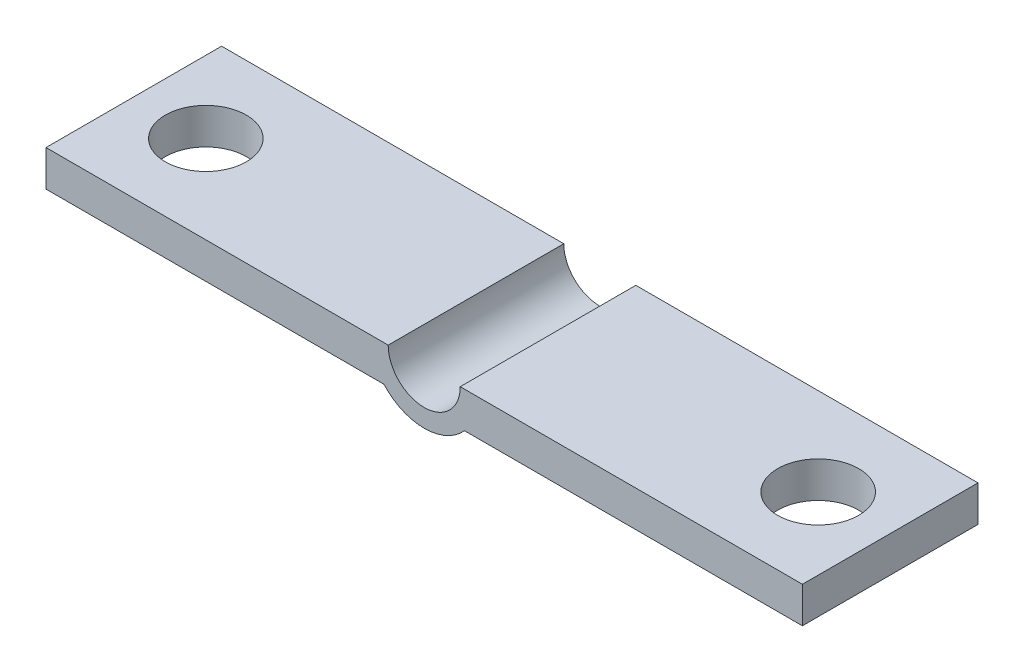
ISO-10303-21;
HEADER;
FILE_DESCRIPTION(('STEP AP214'),'2;1');
FILE_NAME('part.step','',(''),(''),'','','');
FILE_SCHEMA(('AUTOMOTIVE_DESIGN { 1 0 10303 214 1 1 1 1 }'));
ENDSEC;
DATA;
#1=APPLICATION_CONTEXT('core data for automotive mechanical design processes');
#2=APPLICATION_PROTOCOL_DEFINITION('international standard','automotive_design',2000,#1);
#3=PRODUCT_CONTEXT('',#1,'mechanical');
#4=PRODUCT('Part','Part','',(#3));
#5=PRODUCT_RELATED_PRODUCT_CATEGORY('part','',(#4));
#6=PRODUCT_DEFINITION_FORMATION('','',#4);
#7=PRODUCT_DEFINITION_CONTEXT('part definition',#1,'design');
#8=PRODUCT_DEFINITION('design','',#6,#7);
#9=PRODUCT_DEFINITION_SHAPE('','',#8);
#10=(LENGTH_UNIT() NAMED_UNIT(*) SI_UNIT(.MILLI.,.METRE.));
#11=(NAMED_UNIT(*) PLANE_ANGLE_UNIT() SI_UNIT($,.RADIAN.));
#12=(NAMED_UNIT(*) SI_UNIT($,.STERADIAN.) SOLID_ANGLE_UNIT());
#13=UNCERTAINTY_MEASURE_WITH_UNIT(LENGTH_MEASURE(1.E-05),#10,'distance_accuracy_value','');
#14=(GEOMETRIC_REPRESENTATION_CONTEXT(3) GLOBAL_UNCERTAINTY_ASSIGNED_CONTEXT((#13)) GLOBAL_UNIT_ASSIGNED_CONTEXT((#10,
#11,#12)) REPRESENTATION_CONTEXT('',''));
#15=CARTESIAN_POINT('',(0.,0.,0.));
#16=DIRECTION('',(0.,0.,1.));
#17=DIRECTION('',(1.,0.,0.));
#18=AXIS2_PLACEMENT_3D('',#15,#16,#17);
#19=CARTESIAN_POINT('',(0.,0.,9.75));
#20=DIRECTION('',(0.,0.,-1.));
#21=DIRECTION('',(-1.,0.,0.));
#22=AXIS2_PLACEMENT_3D('',#19,#20,#21);
#23=CYLINDRICAL_SURFACE('',#22,3.);
#24=CARTESIAN_POINT('',(0.,0.,0.));
#25=DIRECTION('',(0.,0.,1.));
#26=DIRECTION('',(1.,0.,0.));
#27=AXIS2_PLACEMENT_3D('',#24,#25,#26);
#28=CIRCLE('',#27,3.);
#29=CARTESIAN_POINT('',(-2.23606797749979,-2.,0.));
#30=VERTEX_POINT('',#29);
#31=CARTESIAN_POINT('',(2.23606797749979,-2.,0.));
#32=VERTEX_POINT('',#31);
#33=EDGE_CURVE('E123',#30,#32,#28,.T.);
#34=ORIENTED_EDGE('',*,*,#33,.T.);
#35=DIRECTION('',(0.,0.,-1.));
#36=VECTOR('',#35,1.);
#37=CARTESIAN_POINT('',(2.23606797749979,-2.,9.75));
#38=LINE('',#37,#36);
#39=CARTESIAN_POINT('',(2.23606797749979,-2.,9.75));
#40=VERTEX_POINT('',#39);
#41=EDGE_CURVE('E141',#32,#40,#38,.F.);
#42=ORIENTED_EDGE('',*,*,#41,.T.);
#43=CARTESIAN_POINT('',(0.,0.,9.75));
#44=DIRECTION('',(0.,0.,1.));
#45=DIRECTION('',(1.,0.,0.));
#46=AXIS2_PLACEMENT_3D('',#43,#44,#45);
#47=CIRCLE('',#46,3.);
#48=CARTESIAN_POINT('',(-2.23606797749979,-2.,9.75));
#49=VERTEX_POINT('',#48);
#50=EDGE_CURVE('E62',#49,#40,#47,.T.);
#51=ORIENTED_EDGE('',*,*,#50,.F.);
#52=DIRECTION('',(0.,0.,-1.));
#53=VECTOR('',#52,1.);
#54=CARTESIAN_POINT('',(-2.23606797749979,-2.,9.75));
#55=LINE('',#54,#53);
#56=EDGE_CURVE('E66',#30,#49,#55,.F.);
#57=ORIENTED_EDGE('',*,*,#56,.F.);
#58=EDGE_LOOP('',(#34,#42,#51,#57));
#59=FACE_BOUND('',#58,.T.);
#60=ADVANCED_FACE('F45',(#59),#23,.T.);
#61=CARTESIAN_POINT('',(2.,0.,9.75));
#62=DIRECTION('',(0.,1.,0.));
#63=DIRECTION('',(0.,0.,1.));
#64=AXIS2_PLACEMENT_3D('',#61,#62,#63);
#65=PLANE('',#64);
#66=CARTESIAN_POINT('',(17.,0.,4.875));
#67=DIRECTION('',(0.,1.,0.));
#68=DIRECTION('',(1.,0.,0.));
#69=AXIS2_PLACEMENT_3D('',#66,#67,#68);
#70=CIRCLE('',#69,2.25);
#71=CARTESIAN_POINT('',(19.25,0.,4.875));
#72=VERTEX_POINT('',#71);
#73=EDGE_CURVE('E210',#72,#72,#70,.T.);
#74=ORIENTED_EDGE('',*,*,#73,.F.);
#75=EDGE_LOOP('',(#74));
#76=FACE_BOUND('',#75,.T.);
#77=DIRECTION('',(1.,0.,0.));
#78=VECTOR('',#77,1.);
#79=CARTESIAN_POINT('',(2.,0.,0.));
#80=LINE('',#79,#78);
#81=CARTESIAN_POINT('',(2.,0.,0.));
#82=VERTEX_POINT('',#81);
#83=CARTESIAN_POINT('',(21.,0.,0.));
#84=VERTEX_POINT('',#83);
#85=EDGE_CURVE('E111',#82,#84,#80,.T.);
#86=ORIENTED_EDGE('',*,*,#85,.F.);
#87=DIRECTION('',(0.,0.,-1.));
#88=VECTOR('',#87,1.);
#89=CARTESIAN_POINT('',(2.,0.,9.75));
#90=LINE('',#89,#88);
#91=CARTESIAN_POINT('',(2.,0.,9.75));
#92=VERTEX_POINT('',#91);
#93=EDGE_CURVE('E11',#92,#82,#90,.T.);
#94=ORIENTED_EDGE('',*,*,#93,.F.);
#95=DIRECTION('',(1.,0.,0.));
#96=VECTOR('',#95,1.);
#97=CARTESIAN_POINT('',(2.,0.,9.75));
#98=LINE('',#97,#96);
#99=CARTESIAN_POINT('',(21.,0.,9.75));
#100=VERTEX_POINT('',#99);
#101=EDGE_CURVE('E138',#92,#100,#98,.T.);
#102=ORIENTED_EDGE('',*,*,#101,.T.);
#103=DIRECTION('',(0.,0.,-1.));
#104=VECTOR('',#103,1.);
#105=CARTESIAN_POINT('',(21.,0.,0.));
#106=LINE('',#105,#104);
#107=EDGE_CURVE('E130',#100,#84,#106,.T.);
#108=ORIENTED_EDGE('',*,*,#107,.T.);
#109=EDGE_LOOP('',(#86,#94,#102,#108));
#110=FACE_BOUND('',#109,.T.);
#111=ADVANCED_FACE('F136',(#76,#110),#65,.T.);
#112=CARTESIAN_POINT('',(0.,0.,9.75));
#113=DIRECTION('',(0.,0.,-1.));
#114=DIRECTION('',(-1.,0.,0.));
#115=AXIS2_PLACEMENT_3D('',#112,#113,#114);
#116=CYLINDRICAL_SURFACE('',#115,2.);
#117=CARTESIAN_POINT('',(0.,0.,0.));
#118=DIRECTION('',(0.,0.,1.));
#119=DIRECTION('',(1.,0.,0.));
#120=AXIS2_PLACEMENT_3D('',#117,#118,#119);
#121=CIRCLE('',#120,2.);
#122=CARTESIAN_POINT('',(-2.,0.,0.));
#123=VERTEX_POINT('',#122);
#124=EDGE_CURVE('E119',#123,#82,#121,.T.);
#125=ORIENTED_EDGE('',*,*,#124,.F.);
#126=DIRECTION('',(0.,0.,-1.));
#127=VECTOR('',#126,1.);
#128=CARTESIAN_POINT('',(-2.,0.,9.75));
#129=LINE('',#128,#127);
#130=CARTESIAN_POINT('',(-2.,0.,9.75));
#131=VERTEX_POINT('',#130);
#132=EDGE_CURVE('E54',#131,#123,#129,.T.);
#133=ORIENTED_EDGE('',*,*,#132,.F.);
#134=CARTESIAN_POINT('',(0.,0.,9.75));
#135=DIRECTION('',(0.,0.,1.));
#136=DIRECTION('',(1.,0.,0.));
#137=AXIS2_PLACEMENT_3D('',#134,#135,#136);
#138=CIRCLE('',#137,2.);
#139=EDGE_CURVE('E185',#131,#92,#138,.T.);
#140=ORIENTED_EDGE('',*,*,#139,.T.);
#141=ORIENTED_EDGE('',*,*,#93,.T.);
#142=EDGE_LOOP('',(#125,#133,#140,#141));
#143=FACE_BOUND('',#142,.T.);
#144=ADVANCED_FACE('F235',(#143),#116,.F.);
#145=CARTESIAN_POINT('',(-3.,0.,9.75));
#146=DIRECTION('',(0.,1.,0.));
#147=DIRECTION('',(-1.,0.,0.));
#148=AXIS2_PLACEMENT_3D('',#145,#146,#147);
#149=PLANE('',#148);
#150=CARTESIAN_POINT('',(-17.,0.,4.875));
#151=DIRECTION('',(0.,1.,0.));
#152=DIRECTION('',(-1.,0.,0.));
#153=AXIS2_PLACEMENT_3D('',#150,#151,#152);
#154=CIRCLE('',#153,2.25);
#155=CARTESIAN_POINT('',(-19.25,0.,4.875));
#156=VERTEX_POINT('',#155);
#157=EDGE_CURVE('E203',#156,#156,#154,.T.);
#158=ORIENTED_EDGE('',*,*,#157,.F.);
#159=EDGE_LOOP('',(#158));
#160=FACE_BOUND('',#159,.T.);
#161=DIRECTION('',(1.,0.,0.));
#162=VECTOR('',#161,1.);
#163=CARTESIAN_POINT('',(-3.,0.,0.));
#164=LINE('',#163,#162);
#165=CARTESIAN_POINT('',(-21.,0.,0.));
#166=VERTEX_POINT('',#165);
#167=EDGE_CURVE('E182',#166,#123,#164,.T.);
#168=ORIENTED_EDGE('',*,*,#167,.F.);
#169=DIRECTION('',(0.,0.,1.));
#170=VECTOR('',#169,1.);
#171=CARTESIAN_POINT('',(-21.,0.,0.));
#172=LINE('',#171,#170);
#173=CARTESIAN_POINT('',(-21.,0.,9.75));
#174=VERTEX_POINT('',#173);
#175=EDGE_CURVE('E146',#166,#174,#172,.T.);
#176=ORIENTED_EDGE('',*,*,#175,.T.);
#177=DIRECTION('',(1.,0.,0.));
#178=VECTOR('',#177,1.);
#179=CARTESIAN_POINT('',(-3.,0.,9.75));
#180=LINE('',#179,#178);
#181=EDGE_CURVE('E189',#174,#131,#180,.T.);
#182=ORIENTED_EDGE('',*,*,#181,.T.);
#183=ORIENTED_EDGE('',*,*,#132,.T.);
#184=EDGE_LOOP('',(#168,#176,#182,#183));
#185=FACE_BOUND('',#184,.T.);
#186=ADVANCED_FACE('F233',(#160,#185),#149,.T.);
#187=CARTESIAN_POINT('',(0.,0.,9.75));
#188=DIRECTION('',(0.,0.,1.));
#189=DIRECTION('',(1.,0.,0.));
#190=AXIS2_PLACEMENT_3D('',#187,#188,#189);
#191=PLANE('',#190);
#192=ORIENTED_EDGE('',*,*,#101,.F.);
#193=ORIENTED_EDGE('',*,*,#139,.F.);
#194=ORIENTED_EDGE('',*,*,#181,.F.);
#195=DIRECTION('',(0.,1.,0.));
#196=VECTOR('',#195,1.);
#197=CARTESIAN_POINT('',(-21.,-2.,9.75));
#198=LINE('',#197,#196);
#199=CARTESIAN_POINT('',(-21.,-2.,9.75));
#200=VERTEX_POINT('',#199);
#201=EDGE_CURVE('E167',#200,#174,#198,.T.);
#202=ORIENTED_EDGE('',*,*,#201,.F.);
#203=DIRECTION('',(1.,0.,0.));
#204=VECTOR('',#203,1.);
#205=CARTESIAN_POINT('',(-21.,-2.,9.75));
#206=LINE('',#205,#204);
#207=EDGE_CURVE('E160',#200,#49,#206,.T.);
#208=ORIENTED_EDGE('',*,*,#207,.T.);
#209=ORIENTED_EDGE('',*,*,#50,.T.);
#210=DIRECTION('',(1.,0.,0.));
#211=VECTOR('',#210,1.);
#212=CARTESIAN_POINT('',(2.,-2.,9.75));
#213=LINE('',#212,#211);
#214=CARTESIAN_POINT('',(21.,-2.,9.75));
#215=VERTEX_POINT('',#214);
#216=EDGE_CURVE('E142',#40,#215,#213,.T.);
#217=ORIENTED_EDGE('',*,*,#216,.T.);
#218=DIRECTION('',(0.,1.,0.));
#219=VECTOR('',#218,1.);
#220=CARTESIAN_POINT('',(21.,-2.,9.75));
#221=LINE('',#220,#219);
#222=EDGE_CURVE('E134',#215,#100,#221,.T.);
#223=ORIENTED_EDGE('',*,*,#222,.T.);
#224=EDGE_LOOP('',(#192,#193,#194,#202,#208,#209,#217,#223));
#225=FACE_BOUND('',#224,.T.);
#226=ADVANCED_FACE('F219',(#225),#191,.T.);
#227=CARTESIAN_POINT('',(0.,0.,0.));
#228=DIRECTION('',(0.,0.,1.));
#229=DIRECTION('',(1.,0.,0.));
#230=AXIS2_PLACEMENT_3D('',#227,#228,#229);
#231=PLANE('',#230);
#232=ORIENTED_EDGE('',*,*,#124,.T.);
#233=ORIENTED_EDGE('',*,*,#85,.T.);
#234=DIRECTION('',(0.,1.,0.));
#235=VECTOR('',#234,1.);
#236=CARTESIAN_POINT('',(21.,-2.,0.));
#237=LINE('',#236,#235);
#238=CARTESIAN_POINT('',(21.,-2.,0.));
#239=VERTEX_POINT('',#238);
#240=EDGE_CURVE('E115',#239,#84,#237,.T.);
#241=ORIENTED_EDGE('',*,*,#240,.F.);
#242=DIRECTION('',(-1.,0.,0.));
#243=VECTOR('',#242,1.);
#244=CARTESIAN_POINT('',(2.,-2.,0.));
#245=LINE('',#244,#243);
#246=EDGE_CURVE('E151',#239,#32,#245,.T.);
#247=ORIENTED_EDGE('',*,*,#246,.T.);
#248=ORIENTED_EDGE('',*,*,#33,.F.);
#249=DIRECTION('',(-1.,0.,0.));
#250=VECTOR('',#249,1.);
#251=CARTESIAN_POINT('',(-21.,-2.,0.));
#252=LINE('',#251,#250);
#253=CARTESIAN_POINT('',(-21.,-2.,0.));
#254=VERTEX_POINT('',#253);
#255=EDGE_CURVE('E164',#30,#254,#252,.T.);
#256=ORIENTED_EDGE('',*,*,#255,.T.);
#257=DIRECTION('',(0.,1.,0.));
#258=VECTOR('',#257,1.);
#259=CARTESIAN_POINT('',(-21.,-2.,0.));
#260=LINE('',#259,#258);
#261=EDGE_CURVE('E171',#254,#166,#260,.T.);
#262=ORIENTED_EDGE('',*,*,#261,.T.);
#263=ORIENTED_EDGE('',*,*,#167,.T.);
#264=EDGE_LOOP('',(#232,#233,#241,#247,#248,#256,#262,#263));
#265=FACE_BOUND('',#264,.T.);
#266=ADVANCED_FACE('F113',(#265),#231,.F.);
#267=CARTESIAN_POINT('',(0.,-2.,0.));
#268=DIRECTION('',(0.,1.,0.));
#269=DIRECTION('',(-1.,0.,0.));
#270=AXIS2_PLACEMENT_3D('',#267,#268,#269);
#271=PLANE('',#270);
#272=CARTESIAN_POINT('',(-17.,-2.,4.875));
#273=DIRECTION('',(0.,1.,0.));
#274=DIRECTION('',(-1.,0.,0.));
#275=AXIS2_PLACEMENT_3D('',#272,#273,#274);
#276=CIRCLE('',#275,2.25);
#277=CARTESIAN_POINT('',(-19.25,-2.,4.875));
#278=VERTEX_POINT('',#277);
#279=EDGE_CURVE('E48',#278,#278,#276,.T.);
#280=ORIENTED_EDGE('',*,*,#279,.T.);
#281=EDGE_LOOP('',(#280));
#282=FACE_BOUND('',#281,.T.);
#283=ORIENTED_EDGE('',*,*,#255,.F.);
#284=ORIENTED_EDGE('',*,*,#56,.T.);
#285=ORIENTED_EDGE('',*,*,#207,.F.);
#286=DIRECTION('',(0.,0.,1.));
#287=VECTOR('',#286,1.);
#288=CARTESIAN_POINT('',(-21.,-2.,0.));
#289=LINE('',#288,#287);
#290=EDGE_CURVE('E156',#254,#200,#289,.T.);
#291=ORIENTED_EDGE('',*,*,#290,.F.);
#292=EDGE_LOOP('',(#283,#284,#285,#291));
#293=FACE_BOUND('',#292,.T.);
#294=ADVANCED_FACE('F227',(#282,#293),#271,.F.);
#295=CARTESIAN_POINT('',(-21.,-2.,0.));
#296=DIRECTION('',(-1.,0.,0.));
#297=DIRECTION('',(0.,-1.,0.));
#298=AXIS2_PLACEMENT_3D('',#295,#296,#297);
#299=PLANE('',#298);
#300=ORIENTED_EDGE('',*,*,#175,.F.);
#301=ORIENTED_EDGE('',*,*,#261,.F.);
#302=ORIENTED_EDGE('',*,*,#290,.T.);
#303=ORIENTED_EDGE('',*,*,#201,.T.);
#304=EDGE_LOOP('',(#300,#301,#302,#303));
#305=FACE_BOUND('',#304,.T.);
#306=ADVANCED_FACE('F231',(#305),#299,.T.);
#307=CARTESIAN_POINT('',(0.,-2.,0.));
#308=DIRECTION('',(0.,-1.,0.));
#309=DIRECTION('',(1.,0.,0.));
#310=AXIS2_PLACEMENT_3D('',#307,#308,#309);
#311=PLANE('',#310);
#312=CARTESIAN_POINT('',(17.,-2.,4.875));
#313=DIRECTION('',(0.,-1.,0.));
#314=DIRECTION('',(1.,0.,0.));
#315=AXIS2_PLACEMENT_3D('',#312,#313,#314);
#316=CIRCLE('',#315,2.25);
#317=CARTESIAN_POINT('',(19.25,-2.,4.875));
#318=VERTEX_POINT('',#317);
#319=EDGE_CURVE('E200',#318,#318,#316,.T.);
#320=ORIENTED_EDGE('',*,*,#319,.F.);
#321=EDGE_LOOP('',(#320));
#322=FACE_BOUND('',#321,.T.);
#323=ORIENTED_EDGE('',*,*,#41,.F.);
#324=ORIENTED_EDGE('',*,*,#246,.F.);
#325=DIRECTION('',(0.,0.,-1.));
#326=VECTOR('',#325,1.);
#327=CARTESIAN_POINT('',(21.,-2.,0.));
#328=LINE('',#327,#326);
#329=EDGE_CURVE('E132',#215,#239,#328,.T.);
#330=ORIENTED_EDGE('',*,*,#329,.F.);
#331=ORIENTED_EDGE('',*,*,#216,.F.);
#332=EDGE_LOOP('',(#323,#324,#330,#331));
#333=FACE_BOUND('',#332,.T.);
#334=ADVANCED_FACE('F222',(#322,#333),#311,.T.);
#335=CARTESIAN_POINT('',(21.,-2.,0.));
#336=DIRECTION('',(1.,0.,0.));
#337=DIRECTION('',(0.,1.,0.));
#338=AXIS2_PLACEMENT_3D('',#335,#336,#337);
#339=PLANE('',#338);
#340=ORIENTED_EDGE('',*,*,#107,.F.);
#341=ORIENTED_EDGE('',*,*,#222,.F.);
#342=ORIENTED_EDGE('',*,*,#329,.T.);
#343=ORIENTED_EDGE('',*,*,#240,.T.);
#344=EDGE_LOOP('',(#340,#341,#342,#343));
#345=FACE_BOUND('',#344,.T.);
#346=ADVANCED_FACE('F128',(#345),#339,.T.);
#347=CARTESIAN_POINT('',(17.,-3.,4.875));
#348=DIRECTION('',(0.,1.,0.));
#349=DIRECTION('',(-1.,0.,0.));
#350=AXIS2_PLACEMENT_3D('',#347,#348,#349);
#351=CYLINDRICAL_SURFACE('',#350,2.25);
#352=ORIENTED_EDGE('',*,*,#319,.T.);
#353=EDGE_LOOP('',(#352));
#354=FACE_BOUND('',#353,.T.);
#355=ORIENTED_EDGE('',*,*,#73,.T.);
#356=EDGE_LOOP('',(#355));
#357=FACE_BOUND('',#356,.T.);
#358=ADVANCED_FACE('F278',(#354,#357),#351,.F.);
#359=CARTESIAN_POINT('',(-17.,-3.,4.875));
#360=DIRECTION('',(0.,1.,0.));
#361=DIRECTION('',(-1.,0.,0.));
#362=AXIS2_PLACEMENT_3D('',#359,#360,#361);
#363=CYLINDRICAL_SURFACE('',#362,2.25);
#364=ORIENTED_EDGE('',*,*,#157,.T.);
#365=EDGE_LOOP('',(#364));
#366=FACE_BOUND('',#365,.T.);
#367=ORIENTED_EDGE('',*,*,#279,.F.);
#368=EDGE_LOOP('',(#367));
#369=FACE_BOUND('',#368,.T.);
#370=ADVANCED_FACE('F310',(#366,#369),#363,.F.);
#371=CLOSED_SHELL('',(#60,#111,#144,#186,#226,#266,#294,#306,#334,#346,#358,#370));
#372=MANIFOLD_SOLID_BREP('B2',#371);
#373=ADVANCED_BREP_SHAPE_REPRESENTATION('',(#18,#372),#14);
#374=SHAPE_DEFINITION_REPRESENTATION(#9,#373);
ENDSEC;
END-ISO-10303-21;
